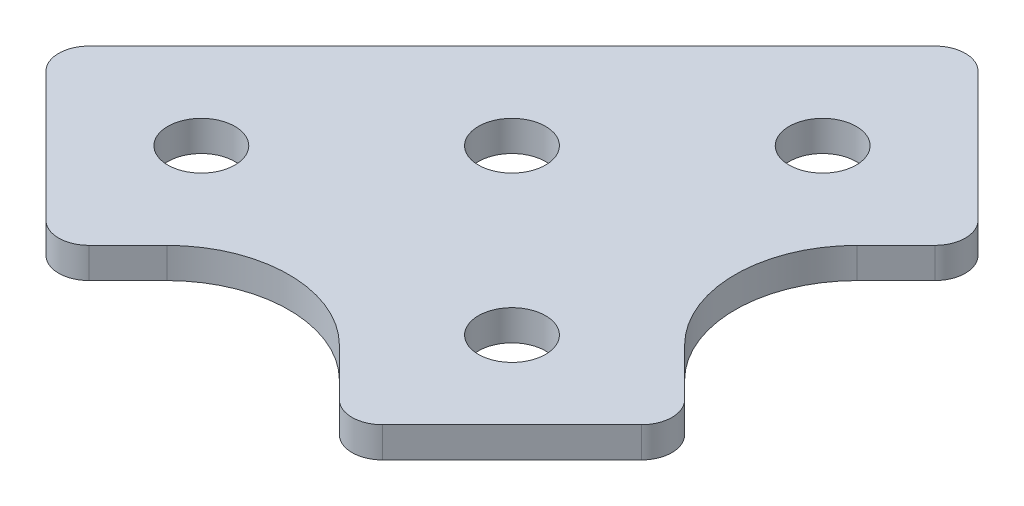
ISO-10303-21;
HEADER;
FILE_DESCRIPTION(('STEP AP214'),'2;1');
FILE_NAME('part.step','',(''),(''),'','','');
FILE_SCHEMA(('AUTOMOTIVE_DESIGN { 1 0 10303 214 1 1 1 1 }'));
ENDSEC;
DATA;
#1=APPLICATION_CONTEXT('core data for automotive mechanical design processes');
#2=APPLICATION_PROTOCOL_DEFINITION('international standard','automotive_design',2000,#1);
#3=PRODUCT_CONTEXT('',#1,'mechanical');
#4=PRODUCT('Part','Part','',(#3));
#5=PRODUCT_RELATED_PRODUCT_CATEGORY('part','',(#4));
#6=PRODUCT_DEFINITION_FORMATION('','',#4);
#7=PRODUCT_DEFINITION_CONTEXT('part definition',#1,'design');
#8=PRODUCT_DEFINITION('design','',#6,#7);
#9=PRODUCT_DEFINITION_SHAPE('','',#8);
#10=(LENGTH_UNIT() NAMED_UNIT(*) SI_UNIT(.MILLI.,.METRE.));
#11=(NAMED_UNIT(*) PLANE_ANGLE_UNIT() SI_UNIT($,.RADIAN.));
#12=(NAMED_UNIT(*) SI_UNIT($,.STERADIAN.) SOLID_ANGLE_UNIT());
#13=UNCERTAINTY_MEASURE_WITH_UNIT(LENGTH_MEASURE(1.E-05),#10,'distance_accuracy_value','');
#14=(GEOMETRIC_REPRESENTATION_CONTEXT(3) GLOBAL_UNCERTAINTY_ASSIGNED_CONTEXT((#13)) GLOBAL_UNIT_ASSIGNED_CONTEXT((#10,
#11,#12)) REPRESENTATION_CONTEXT('',''));
#15=CARTESIAN_POINT('',(0.,0.,0.));
#16=DIRECTION('',(0.,0.,1.));
#17=DIRECTION('',(1.,0.,0.));
#18=AXIS2_PLACEMENT_3D('',#15,#16,#17);
#19=CARTESIAN_POINT('',(0.,3.175,0.));
#20=DIRECTION('',(0.707106781186548,0.,0.707106781186547));
#21=DIRECTION('',(0.707106781186547,0.,-0.707106781186548));
#22=AXIS2_PLACEMENT_3D('',#19,#20,#21);
#23=PLANE('',#22);
#24=DIRECTION('',(-0.707106781186546,0.,0.707106781186548));
#25=VECTOR('',#24,1.);
#26=CARTESIAN_POINT('',(0.,3.175,0.));
#27=LINE('',#26,#25);
#28=CARTESIAN_POINT('',(-8.98025612106918,3.175,8.9802561210692));
#29=VERTEX_POINT('',#28);
#30=CARTESIAN_POINT('',(-13.0213713755503,3.175,13.0213713755503));
#31=VERTEX_POINT('',#30);
#32=EDGE_CURVE('E314',#29,#31,#27,.T.);
#33=ORIENTED_EDGE('',*,*,#32,.T.);
#34=DIRECTION('',(0.,1.,0.));
#35=VECTOR('',#34,1.);
#36=CARTESIAN_POINT('',(-13.0213713755503,3.175,13.0213713755504));
#37=LINE('',#36,#35);
#38=CARTESIAN_POINT('',(-13.0213713755503,0.,13.0213713755503));
#39=VERTEX_POINT('',#38);
#40=EDGE_CURVE('E11',#31,#39,#37,.F.);
#41=ORIENTED_EDGE('',*,*,#40,.T.);
#42=DIRECTION('',(-0.707106781186546,0.,0.707106781186548));
#43=VECTOR('',#42,1.);
#44=CARTESIAN_POINT('',(0.,0.,0.));
#45=LINE('',#44,#43);
#46=CARTESIAN_POINT('',(-8.98025612106918,0.,8.9802561210692));
#47=VERTEX_POINT('',#46);
#48=EDGE_CURVE('E327',#47,#39,#45,.T.);
#49=ORIENTED_EDGE('',*,*,#48,.F.);
#50=DIRECTION('',(0.,-1.,0.));
#51=VECTOR('',#50,1.);
#52=CARTESIAN_POINT('',(-8.98025612106918,3.175,8.98025612106921));
#53=LINE('',#52,#51);
#54=EDGE_CURVE('E204',#47,#29,#53,.F.);
#55=ORIENTED_EDGE('',*,*,#54,.T.);
#56=EDGE_LOOP('',(#33,#41,#49,#55));
#57=FACE_BOUND('',#56,.T.);
#58=ADVANCED_FACE('F45',(#57),#23,.T.);
#59=CARTESIAN_POINT('',(32.3289220358488,3.175,32.3289220358491));
#60=DIRECTION('',(-0.70710678118655,0.,0.707106781186545));
#61=DIRECTION('',(0.707106781186545,0.,0.70710678118655));
#62=AXIS2_PLACEMENT_3D('',#59,#60,#61);
#63=PLANE('',#62);
#64=DIRECTION('',(-0.707106781186545,0.,-0.70710678118655));
#65=VECTOR('',#64,1.);
#66=CARTESIAN_POINT('',(32.3289220358488,0.,32.3289220358491));
#67=LINE('',#66,#65);
#68=CARTESIAN_POINT('',(13.9193969876572,0.,13.9193969876573));
#69=VERTEX_POINT('',#68);
#70=CARTESIAN_POINT('',(8.98025612106917,0.,8.98025612106923));
#71=VERTEX_POINT('',#70);
#72=EDGE_CURVE('E330',#69,#71,#67,.T.);
#73=ORIENTED_EDGE('',*,*,#72,.F.);
#74=DIRECTION('',(0.,1.,0.));
#75=VECTOR('',#74,1.);
#76=CARTESIAN_POINT('',(13.9193969876572,3.175,13.9193969876573));
#77=LINE('',#76,#75);
#78=CARTESIAN_POINT('',(13.9193969876572,3.175,13.9193969876573));
#79=VERTEX_POINT('',#78);
#80=EDGE_CURVE('E260',#69,#79,#77,.T.);
#81=ORIENTED_EDGE('',*,*,#80,.T.);
#82=DIRECTION('',(-0.707106781186545,0.,-0.70710678118655));
#83=VECTOR('',#82,1.);
#84=CARTESIAN_POINT('',(32.3289220358488,3.175,32.3289220358491));
#85=LINE('',#84,#83);
#86=CARTESIAN_POINT('',(8.98025612106917,3.175,8.98025612106923));
#87=VERTEX_POINT('',#86);
#88=EDGE_CURVE('E195',#79,#87,#85,.T.);
#89=ORIENTED_EDGE('',*,*,#88,.T.);
#90=DIRECTION('',(0.,-1.,0.));
#91=VECTOR('',#90,1.);
#92=CARTESIAN_POINT('',(8.98025612106916,0.,8.98025612106922));
#93=LINE('',#92,#91);
#94=EDGE_CURVE('E193',#87,#71,#93,.T.);
#95=ORIENTED_EDGE('',*,*,#94,.T.);
#96=EDGE_LOOP('',(#73,#81,#89,#95));
#97=FACE_BOUND('',#96,.T.);
#98=ADVANCED_FACE('F412',(#97),#63,.T.);
#99=CARTESIAN_POINT('',(0.,3.175,-35.9210244842767));
#100=DIRECTION('',(0.707106781186549,0.,-0.707106781186546));
#101=DIRECTION('',(-0.707106781186546,0.,-0.707106781186549));
#102=AXIS2_PLACEMENT_3D('',#99,#100,#101);
#103=PLANE('',#102);
#104=DIRECTION('',(-0.707106781186545,0.,-0.70710678118655));
#105=VECTOR('',#104,1.);
#106=CARTESIAN_POINT('',(50.2894342779872,3.175,14.3684097937108));
#107=LINE('',#106,#105);
#108=CARTESIAN_POINT('',(31.8799092297956,3.175,-4.04111525448094));
#109=VERTEX_POINT('',#108);
#110=CARTESIAN_POINT('',(26.9407683632075,3.175,-8.98025612106905));
#111=VERTEX_POINT('',#110);
#112=EDGE_CURVE('E167',#109,#111,#107,.T.);
#113=ORIENTED_EDGE('',*,*,#112,.F.);
#114=DIRECTION('',(0.,1.,0.));
#115=VECTOR('',#114,1.);
#116=CARTESIAN_POINT('',(31.8799092297956,3.175,-4.04111525448096));
#117=LINE('',#116,#115);
#118=CARTESIAN_POINT('',(31.8799092297956,0.,-4.04111525448097));
#119=VERTEX_POINT('',#118);
#120=EDGE_CURVE('E240',#109,#119,#117,.F.);
#121=ORIENTED_EDGE('',*,*,#120,.T.);
#122=DIRECTION('',(0.707106781186546,0.,0.707106781186549));
#123=VECTOR('',#122,1.);
#124=CARTESIAN_POINT('',(0.,0.,-35.9210244842767));
#125=LINE('',#124,#123);
#126=CARTESIAN_POINT('',(26.9407683632075,0.,-8.98025612106907));
#127=VERTEX_POINT('',#126);
#128=EDGE_CURVE('E320',#127,#119,#125,.T.);
#129=ORIENTED_EDGE('',*,*,#128,.F.);
#130=DIRECTION('',(0.,-1.,0.));
#131=VECTOR('',#130,1.);
#132=CARTESIAN_POINT('',(26.9407683632075,3.175,-8.98025612106907));
#133=LINE('',#132,#131);
#134=EDGE_CURVE('E189',#127,#111,#133,.F.);
#135=ORIENTED_EDGE('',*,*,#134,.T.);
#136=EDGE_LOOP('',(#113,#121,#129,#135));
#137=FACE_BOUND('',#136,.T.);
#138=ADVANCED_FACE('F418',(#137),#103,.T.);
#139=CARTESIAN_POINT('',(-17.9605122421382,3.175,-17.9605122421383));
#140=DIRECTION('',(-0.70710678118655,0.,-0.707106781186545));
#141=DIRECTION('',(-0.707106781186545,0.,0.70710678118655));
#142=AXIS2_PLACEMENT_3D('',#139,#140,#141);
#143=PLANE('',#142);
#144=DIRECTION('',(-0.707106781186547,0.,0.707106781186548));
#145=VECTOR('',#144,1.);
#146=CARTESIAN_POINT('',(-17.9605122421382,3.175,-17.9605122421383));
#147=LINE('',#146,#145);
#148=CARTESIAN_POINT('',(13.0213713755503,3.175,-48.9423958598269));
#149=VERTEX_POINT('',#148);
#150=CARTESIAN_POINT('',(-30.9818836176886,3.175,-4.93914086658794));
#151=VERTEX_POINT('',#150);
#152=EDGE_CURVE('E310',#149,#151,#147,.T.);
#153=ORIENTED_EDGE('',*,*,#152,.F.);
#154=DIRECTION('',(0.,1.,0.));
#155=VECTOR('',#154,1.);
#156=CARTESIAN_POINT('',(13.0213713755502,0.,-48.942395859827));
#157=LINE('',#156,#155);
#158=CARTESIAN_POINT('',(13.0213713755502,0.,-48.942395859827));
#159=VERTEX_POINT('',#158);
#160=EDGE_CURVE('E274',#149,#159,#157,.F.);
#161=ORIENTED_EDGE('',*,*,#160,.T.);
#162=DIRECTION('',(0.707106781186545,0.,-0.70710678118655));
#163=VECTOR('',#162,1.);
#164=CARTESIAN_POINT('',(-17.9605122421382,0.,-17.9605122421383));
#165=LINE('',#164,#163);
#166=CARTESIAN_POINT('',(-30.9818836176886,0.,-4.9391408665879));
#167=VERTEX_POINT('',#166);
#168=EDGE_CURVE('E198',#167,#159,#165,.T.);
#169=ORIENTED_EDGE('',*,*,#168,.F.);
#170=DIRECTION('',(0.,1.,0.));
#171=VECTOR('',#170,1.);
#172=CARTESIAN_POINT('',(-30.9818836176886,3.175,-4.9391408665879));
#173=LINE('',#172,#171);
#174=EDGE_CURVE('E270',#167,#151,#173,.T.);
#175=ORIENTED_EDGE('',*,*,#174,.T.);
#176=EDGE_LOOP('',(#153,#161,#169,#175));
#177=FACE_BOUND('',#176,.T.);
#178=ADVANCED_FACE('F309',(#177),#143,.T.);
#179=CARTESIAN_POINT('',(0.,3.175,0.));
#180=DIRECTION('',(0.,-1.,0.));
#181=DIRECTION('',(0.,0.,-1.));
#182=AXIS2_PLACEMENT_3D('',#179,#180,#181);
#183=PLANE('',#182);
#184=CARTESIAN_POINT('',(-16.1644610179244,3.175,-1.79605122421382));
#185=DIRECTION('',(0.,1.,0.));
#186=DIRECTION('',(0.,0.,1.));
#187=AXIS2_PLACEMENT_3D('',#184,#185,#186);
#188=CIRCLE('',#187,3.49250000000001);
#189=CARTESIAN_POINT('',(-16.1644610179244,3.175,1.69644877578618));
#190=VERTEX_POINT('',#189);
#191=EDGE_CURVE('E376',#190,#190,#188,.T.);
#192=ORIENTED_EDGE('',*,*,#191,.F.);
#193=EDGE_LOOP('',(#192));
#194=FACE_BOUND('',#193,.T.);
#195=CARTESIAN_POINT('',(0.,3.175,-17.9605122421383));
#196=DIRECTION('',(0.,1.,0.));
#197=DIRECTION('',(0.,0.,1.));
#198=AXIS2_PLACEMENT_3D('',#195,#196,#197);
#199=CIRCLE('',#198,3.49250000000001);
#200=CARTESIAN_POINT('',(0.,3.175,-14.4680122421383));
#201=VERTEX_POINT('',#200);
#202=EDGE_CURVE('E322',#201,#201,#199,.T.);
#203=ORIENTED_EDGE('',*,*,#202,.F.);
#204=EDGE_LOOP('',(#203));
#205=FACE_BOUND('',#204,.T.);
#206=CARTESIAN_POINT('',(17.0624866300314,3.175,-0.898025612106839));
#207=DIRECTION('',(0.,1.,0.));
#208=DIRECTION('',(0.,0.,1.));
#209=AXIS2_PLACEMENT_3D('',#206,#207,#208);
#210=CIRCLE('',#209,3.4925);
#211=CARTESIAN_POINT('',(17.0624866300314,3.175,2.59447438789316));
#212=VERTEX_POINT('',#211);
#213=EDGE_CURVE('E184',#212,#212,#210,.T.);
#214=ORIENTED_EDGE('',*,*,#213,.F.);
#215=EDGE_LOOP('',(#214));
#216=FACE_BOUND('',#215,.T.);
#217=CARTESIAN_POINT('',(16.1644610179245,3.175,-34.1249732600627));
#218=DIRECTION('',(0.,-1.,0.));
#219=DIRECTION('',(1.,0.,0.));
#220=AXIS2_PLACEMENT_3D('',#217,#218,#219);
#221=CIRCLE('',#220,3.49250000000001);
#222=CARTESIAN_POINT('',(19.6569610179246,3.175,-34.1249732600627));
#223=VERTEX_POINT('',#222);
#224=EDGE_CURVE('E302',#223,#223,#221,.T.);
#225=ORIENTED_EDGE('',*,*,#224,.T.);
#226=EDGE_LOOP('',(#225));
#227=FACE_BOUND('',#226,.T.);
#228=DIRECTION('',(0.70710678118655,0.,-0.707106781186545));
#229=VECTOR('',#228,1.);
#230=CARTESIAN_POINT('',(16.1644610179245,3.175,16.1644610179246));
#231=LINE('',#230,#229);
#232=CARTESIAN_POINT('',(18.4095250481918,3.175,13.9193969876573));
#233=VERTEX_POINT('',#232);
#234=CARTESIAN_POINT('',(31.8799092297956,3.175,0.449012806053611));
#235=VERTEX_POINT('',#234);
#236=EDGE_CURVE('E346',#233,#235,#231,.T.);
#237=ORIENTED_EDGE('',*,*,#236,.T.);
#238=CARTESIAN_POINT('',(29.6348451995283,3.175,-1.79605122421368));
#239=DIRECTION('',(0.,-1.,0.));
#240=DIRECTION('',(0.,0.,-1.));
#241=AXIS2_PLACEMENT_3D('',#238,#239,#240);
#242=CIRCLE('',#241,3.175);
#243=EDGE_CURVE('E237',#235,#109,#242,.F.);
#244=ORIENTED_EDGE('',*,*,#243,.T.);
#245=ORIENTED_EDGE('',*,*,#112,.T.);
#246=CARTESIAN_POINT('',(35.9210244842767,3.175,-17.9605122421382));
#247=DIRECTION('',(0.,-1.,0.));
#248=DIRECTION('',(0.,0.,-1.));
#249=AXIS2_PLACEMENT_3D('',#246,#247,#248);
#250=CIRCLE('',#249,12.7);
#251=CARTESIAN_POINT('',(26.9407683632076,3.175,-26.9407683632074));
#252=VERTEX_POINT('',#251);
#253=EDGE_CURVE('E161',#111,#252,#250,.T.);
#254=ORIENTED_EDGE('',*,*,#253,.T.);
#255=DIRECTION('',(0.707106781186551,0.,-0.707106781186544));
#256=VECTOR('',#255,1.);
#257=CARTESIAN_POINT('',(17.9605122421383,3.175,-17.9605122421382));
#258=LINE('',#257,#256);
#259=CARTESIAN_POINT('',(30.9818836176887,3.175,-30.9818836176885));
#260=VERTEX_POINT('',#259);
#261=EDGE_CURVE('E165',#252,#260,#258,.T.);
#262=ORIENTED_EDGE('',*,*,#261,.T.);
#263=CARTESIAN_POINT('',(28.7368195874214,3.175,-33.2269476479558));
#264=DIRECTION('',(0.,-1.,0.));
#265=DIRECTION('',(0.,0.,-1.));
#266=AXIS2_PLACEMENT_3D('',#263,#264,#265);
#267=CIRCLE('',#266,3.175);
#268=CARTESIAN_POINT('',(30.9818836176887,3.175,-35.4720116782231));
#269=VERTEX_POINT('',#268);
#270=EDGE_CURVE('E228',#260,#269,#267,.F.);
#271=ORIENTED_EDGE('',*,*,#270,.T.);
#272=DIRECTION('',(0.707106781186548,0.,0.707106781186548));
#273=VECTOR('',#272,1.);
#274=CARTESIAN_POINT('',(33.2269476479559,3.175,-33.2269476479559));
#275=LINE('',#274,#273);
#276=CARTESIAN_POINT('',(17.5114994360848,3.175,-48.942395859827));
#277=VERTEX_POINT('',#276);
#278=EDGE_CURVE('E353',#277,#269,#275,.T.);
#279=ORIENTED_EDGE('',*,*,#278,.F.);
#280=CARTESIAN_POINT('',(15.2664354058175,3.175,-46.6973318295597));
#281=DIRECTION('',(0.,-1.,0.));
#282=DIRECTION('',(0.,0.,-1.));
#283=AXIS2_PLACEMENT_3D('',#280,#281,#282);
#284=CIRCLE('',#283,3.175);
#285=EDGE_CURVE('E231',#277,#149,#284,.F.);
#286=ORIENTED_EDGE('',*,*,#285,.T.);
#287=ORIENTED_EDGE('',*,*,#152,.T.);
#288=CARTESIAN_POINT('',(-28.7368195874213,3.175,-2.69407683632062));
#289=DIRECTION('',(0.,-1.,0.));
#290=DIRECTION('',(0.,0.,-1.));
#291=AXIS2_PLACEMENT_3D('',#288,#289,#290);
#292=CIRCLE('',#291,3.175);
#293=CARTESIAN_POINT('',(-30.9818836176886,3.175,-0.449012806053337));
#294=VERTEX_POINT('',#293);
#295=EDGE_CURVE('E225',#151,#294,#292,.F.);
#296=ORIENTED_EDGE('',*,*,#295,.T.);
#297=DIRECTION('',(0.707106781186547,0.,0.707106781186548));
#298=VECTOR('',#297,1.);
#299=CARTESIAN_POINT('',(-15.2664354058176,3.175,15.2664354058176));
#300=LINE('',#299,#298);
#301=CARTESIAN_POINT('',(-17.5114994360849,3.175,13.0213713755504));
#302=VERTEX_POINT('',#301);
#303=EDGE_CURVE('E292',#294,#302,#300,.T.);
#304=ORIENTED_EDGE('',*,*,#303,.T.);
#305=CARTESIAN_POINT('',(-15.2664354058176,3.175,10.7763073452831));
#306=DIRECTION('',(0.,-1.,0.));
#307=DIRECTION('',(0.,0.,-1.));
#308=AXIS2_PLACEMENT_3D('',#305,#306,#307);
#309=CIRCLE('',#308,3.175);
#310=EDGE_CURVE('E222',#302,#31,#309,.F.);
#311=ORIENTED_EDGE('',*,*,#310,.T.);
#312=ORIENTED_EDGE('',*,*,#32,.F.);
#313=CARTESIAN_POINT('',(0.,3.175,17.9605122421383));
#314=DIRECTION('',(0.,-1.,0.));
#315=DIRECTION('',(0.,0.,-1.));
#316=AXIS2_PLACEMENT_3D('',#313,#314,#315);
#317=CIRCLE('',#316,12.7);
#318=EDGE_CURVE('E211',#29,#87,#317,.T.);
#319=ORIENTED_EDGE('',*,*,#318,.T.);
#320=ORIENTED_EDGE('',*,*,#88,.F.);
#321=CARTESIAN_POINT('',(16.1644610179245,3.175,11.67433295739));
#322=DIRECTION('',(0.,-1.,0.));
#323=DIRECTION('',(0.,0.,-1.));
#324=AXIS2_PLACEMENT_3D('',#321,#322,#323);
#325=CIRCLE('',#324,3.175);
#326=EDGE_CURVE('E234',#79,#233,#325,.F.);
#327=ORIENTED_EDGE('',*,*,#326,.T.);
#328=EDGE_LOOP('',(#237,#244,#245,#254,#262,#271,#279,#286,#287,#296,#304,#311,#312,#319,#320,#327));
#329=FACE_BOUND('',#328,.T.);
#330=ADVANCED_FACE('F164',(#194,#205,#216,#227,#329),#183,.F.);
#331=CARTESIAN_POINT('',(0.,0.,0.));
#332=DIRECTION('',(0.,-1.,0.));
#333=DIRECTION('',(0.,0.,-1.));
#334=AXIS2_PLACEMENT_3D('',#331,#332,#333);
#335=PLANE('',#334);
#336=CARTESIAN_POINT('',(-16.1644610179244,0.,-1.79605122421382));
#337=DIRECTION('',(0.,1.,0.));
#338=DIRECTION('',(0.,0.,1.));
#339=AXIS2_PLACEMENT_3D('',#336,#337,#338);
#340=CIRCLE('',#339,3.49250000000001);
#341=CARTESIAN_POINT('',(-16.1644610179244,0.,1.69644877578618));
#342=VERTEX_POINT('',#341);
#343=EDGE_CURVE('E331',#342,#342,#340,.T.);
#344=ORIENTED_EDGE('',*,*,#343,.T.);
#345=EDGE_LOOP('',(#344));
#346=FACE_BOUND('',#345,.T.);
#347=CARTESIAN_POINT('',(0.,0.,-17.9605122421383));
#348=DIRECTION('',(0.,1.,0.));
#349=DIRECTION('',(0.,0.,1.));
#350=AXIS2_PLACEMENT_3D('',#347,#348,#349);
#351=CIRCLE('',#350,3.49250000000001);
#352=CARTESIAN_POINT('',(0.,0.,-14.4680122421383));
#353=VERTEX_POINT('',#352);
#354=EDGE_CURVE('E379',#353,#353,#351,.T.);
#355=ORIENTED_EDGE('',*,*,#354,.T.);
#356=EDGE_LOOP('',(#355));
#357=FACE_BOUND('',#356,.T.);
#358=CARTESIAN_POINT('',(17.0624866300314,0.,-0.898025612106839));
#359=DIRECTION('',(0.,1.,0.));
#360=DIRECTION('',(0.,0.,1.));
#361=AXIS2_PLACEMENT_3D('',#358,#359,#360);
#362=CIRCLE('',#361,3.4925);
#363=CARTESIAN_POINT('',(17.0624866300314,0.,2.59447438789316));
#364=VERTEX_POINT('',#363);
#365=EDGE_CURVE('E366',#364,#364,#362,.T.);
#366=ORIENTED_EDGE('',*,*,#365,.T.);
#367=EDGE_LOOP('',(#366));
#368=FACE_BOUND('',#367,.T.);
#369=CARTESIAN_POINT('',(16.1644610179245,0.,-34.1249732600627));
#370=DIRECTION('',(0.,-1.,0.));
#371=DIRECTION('',(1.,0.,0.));
#372=AXIS2_PLACEMENT_3D('',#369,#370,#371);
#373=CIRCLE('',#372,3.49250000000001);
#374=CARTESIAN_POINT('',(19.6569610179246,0.,-34.1249732600627));
#375=VERTEX_POINT('',#374);
#376=EDGE_CURVE('E357',#375,#375,#373,.T.);
#377=ORIENTED_EDGE('',*,*,#376,.F.);
#378=EDGE_LOOP('',(#377));
#379=FACE_BOUND('',#378,.T.);
#380=ORIENTED_EDGE('',*,*,#128,.T.);
#381=CARTESIAN_POINT('',(29.6348451995283,0.,-1.79605122421368));
#382=DIRECTION('',(0.,-1.,0.));
#383=DIRECTION('',(0.,0.,-1.));
#384=AXIS2_PLACEMENT_3D('',#381,#382,#383);
#385=CIRCLE('',#384,3.175);
#386=CARTESIAN_POINT('',(31.8799092297956,0.,0.449012806053611));
#387=VERTEX_POINT('',#386);
#388=EDGE_CURVE('E257',#119,#387,#385,.T.);
#389=ORIENTED_EDGE('',*,*,#388,.T.);
#390=DIRECTION('',(0.70710678118655,0.,-0.707106781186545));
#391=VECTOR('',#390,1.);
#392=CARTESIAN_POINT('',(16.1644610179245,0.,16.1644610179246));
#393=LINE('',#392,#391);
#394=CARTESIAN_POINT('',(18.4095250481918,0.,13.9193969876573));
#395=VERTEX_POINT('',#394);
#396=EDGE_CURVE('E348',#395,#387,#393,.T.);
#397=ORIENTED_EDGE('',*,*,#396,.F.);
#398=CARTESIAN_POINT('',(16.1644610179245,0.,11.67433295739));
#399=DIRECTION('',(0.,-1.,0.));
#400=DIRECTION('',(0.,0.,-1.));
#401=AXIS2_PLACEMENT_3D('',#398,#399,#400);
#402=CIRCLE('',#401,3.175);
#403=EDGE_CURVE('E254',#395,#69,#402,.T.);
#404=ORIENTED_EDGE('',*,*,#403,.T.);
#405=ORIENTED_EDGE('',*,*,#72,.T.);
#406=CARTESIAN_POINT('',(0.,0.,17.9605122421383));
#407=DIRECTION('',(0.,-1.,0.));
#408=DIRECTION('',(0.,0.,-1.));
#409=AXIS2_PLACEMENT_3D('',#406,#407,#408);
#410=CIRCLE('',#409,12.7);
#411=EDGE_CURVE('E173',#71,#47,#410,.F.);
#412=ORIENTED_EDGE('',*,*,#411,.T.);
#413=ORIENTED_EDGE('',*,*,#48,.T.);
#414=CARTESIAN_POINT('',(-15.2664354058176,0.,10.7763073452831));
#415=DIRECTION('',(0.,-1.,0.));
#416=DIRECTION('',(0.,0.,-1.));
#417=AXIS2_PLACEMENT_3D('',#414,#415,#416);
#418=CIRCLE('',#417,3.175);
#419=CARTESIAN_POINT('',(-17.5114994360849,0.,13.0213713755504));
#420=VERTEX_POINT('',#419);
#421=EDGE_CURVE('E243',#39,#420,#418,.T.);
#422=ORIENTED_EDGE('',*,*,#421,.T.);
#423=DIRECTION('',(0.707106781186547,0.,0.707106781186548));
#424=VECTOR('',#423,1.);
#425=CARTESIAN_POINT('',(-15.2664354058176,0.,15.2664354058176));
#426=LINE('',#425,#424);
#427=CARTESIAN_POINT('',(-30.9818836176886,0.,-0.449012806053337));
#428=VERTEX_POINT('',#427);
#429=EDGE_CURVE('E289',#428,#420,#426,.T.);
#430=ORIENTED_EDGE('',*,*,#429,.F.);
#431=CARTESIAN_POINT('',(-28.7368195874213,0.,-2.69407683632062));
#432=DIRECTION('',(0.,-1.,0.));
#433=DIRECTION('',(0.,0.,-1.));
#434=AXIS2_PLACEMENT_3D('',#431,#432,#433);
#435=CIRCLE('',#434,3.175);
#436=EDGE_CURVE('E246',#428,#167,#435,.T.);
#437=ORIENTED_EDGE('',*,*,#436,.T.);
#438=ORIENTED_EDGE('',*,*,#168,.T.);
#439=CARTESIAN_POINT('',(15.2664354058175,0.,-46.6973318295597));
#440=DIRECTION('',(0.,-1.,0.));
#441=DIRECTION('',(0.,0.,-1.));
#442=AXIS2_PLACEMENT_3D('',#439,#440,#441);
#443=CIRCLE('',#442,3.175);
#444=CARTESIAN_POINT('',(17.5114994360848,0.,-48.942395859827));
#445=VERTEX_POINT('',#444);
#446=EDGE_CURVE('E251',#159,#445,#443,.T.);
#447=ORIENTED_EDGE('',*,*,#446,.T.);
#448=DIRECTION('',(0.707106781186548,0.,0.707106781186548));
#449=VECTOR('',#448,1.);
#450=CARTESIAN_POINT('',(33.2269476479559,0.,-33.2269476479559));
#451=LINE('',#450,#449);
#452=CARTESIAN_POINT('',(30.9818836176887,0.,-35.4720116782231));
#453=VERTEX_POINT('',#452);
#454=EDGE_CURVE('E452',#445,#453,#451,.T.);
#455=ORIENTED_EDGE('',*,*,#454,.T.);
#456=CARTESIAN_POINT('',(28.7368195874214,0.,-33.2269476479558));
#457=DIRECTION('',(0.,-1.,0.));
#458=DIRECTION('',(0.,0.,-1.));
#459=AXIS2_PLACEMENT_3D('',#456,#457,#458);
#460=CIRCLE('',#459,3.175);
#461=CARTESIAN_POINT('',(30.9818836176887,0.,-30.9818836176885));
#462=VERTEX_POINT('',#461);
#463=EDGE_CURVE('E61',#453,#462,#460,.T.);
#464=ORIENTED_EDGE('',*,*,#463,.T.);
#465=DIRECTION('',(0.707106781186551,0.,-0.707106781186544));
#466=VECTOR('',#465,1.);
#467=CARTESIAN_POINT('',(17.9605122421383,0.,-17.9605122421382));
#468=LINE('',#467,#466);
#469=CARTESIAN_POINT('',(26.9407683632076,0.,-26.9407683632074));
#470=VERTEX_POINT('',#469);
#471=EDGE_CURVE('E185',#470,#462,#468,.T.);
#472=ORIENTED_EDGE('',*,*,#471,.F.);
#473=CARTESIAN_POINT('',(35.9210244842767,0.,-17.9605122421382));
#474=DIRECTION('',(0.,-1.,0.));
#475=DIRECTION('',(0.,0.,-1.));
#476=AXIS2_PLACEMENT_3D('',#473,#474,#475);
#477=CIRCLE('',#476,12.7);
#478=EDGE_CURVE('E174',#470,#127,#477,.F.);
#479=ORIENTED_EDGE('',*,*,#478,.T.);
#480=EDGE_LOOP('',(#380,#389,#397,#404,#405,#412,#413,#422,#430,#437,#438,#447,#455,#464,#472,#479));
#481=FACE_BOUND('',#480,.T.);
#482=ADVANCED_FACE('F296',(#346,#357,#368,#379,#481),#335,.T.);
#483=CARTESIAN_POINT('',(0.,0.,-17.9605122421383));
#484=DIRECTION('',(0.,1.,0.));
#485=DIRECTION('',(0.,0.,1.));
#486=AXIS2_PLACEMENT_3D('',#483,#484,#485);
#487=CYLINDRICAL_SURFACE('',#486,3.49250000000001);
#488=ORIENTED_EDGE('',*,*,#354,.F.);
#489=EDGE_LOOP('',(#488));
#490=FACE_BOUND('',#489,.T.);
#491=ORIENTED_EDGE('',*,*,#202,.T.);
#492=EDGE_LOOP('',(#491));
#493=FACE_BOUND('',#492,.T.);
#494=ADVANCED_FACE('F388',(#490,#493),#487,.F.);
#495=CARTESIAN_POINT('',(-16.1644610179244,0.,-1.79605122421382));
#496=DIRECTION('',(0.,1.,0.));
#497=DIRECTION('',(0.,0.,1.));
#498=AXIS2_PLACEMENT_3D('',#495,#496,#497);
#499=CYLINDRICAL_SURFACE('',#498,3.49250000000001);
#500=ORIENTED_EDGE('',*,*,#343,.F.);
#501=EDGE_LOOP('',(#500));
#502=FACE_BOUND('',#501,.T.);
#503=ORIENTED_EDGE('',*,*,#191,.T.);
#504=EDGE_LOOP('',(#503));
#505=FACE_BOUND('',#504,.T.);
#506=ADVANCED_FACE('F607',(#502,#505),#499,.F.);
#507=CARTESIAN_POINT('',(17.0624866300314,0.,-0.898025612106839));
#508=DIRECTION('',(0.,1.,0.));
#509=DIRECTION('',(0.,0.,1.));
#510=AXIS2_PLACEMENT_3D('',#507,#508,#509);
#511=CYLINDRICAL_SURFACE('',#510,3.4925);
#512=ORIENTED_EDGE('',*,*,#365,.F.);
#513=EDGE_LOOP('',(#512));
#514=FACE_BOUND('',#513,.T.);
#515=ORIENTED_EDGE('',*,*,#213,.T.);
#516=EDGE_LOOP('',(#515));
#517=FACE_BOUND('',#516,.T.);
#518=ADVANCED_FACE('F408',(#514,#517),#511,.F.);
#519=CARTESIAN_POINT('',(17.9605122421383,3.175,-17.9605122421382));
#520=DIRECTION('',(0.707106781186544,0.,0.707106781186551));
#521=DIRECTION('',(-0.707106781186551,0.,0.707106781186544));
#522=AXIS2_PLACEMENT_3D('',#519,#520,#521);
#523=PLANE('',#522);
#524=ORIENTED_EDGE('',*,*,#471,.T.);
#525=DIRECTION('',(0.,1.,0.));
#526=VECTOR('',#525,1.);
#527=CARTESIAN_POINT('',(30.9818836176887,3.175,-30.9818836176885));
#528=LINE('',#527,#526);
#529=EDGE_CURVE('E182',#462,#260,#528,.T.);
#530=ORIENTED_EDGE('',*,*,#529,.T.);
#531=ORIENTED_EDGE('',*,*,#261,.F.);
#532=DIRECTION('',(0.,-1.,0.));
#533=VECTOR('',#532,1.);
#534=CARTESIAN_POINT('',(26.9407683632076,0.,-26.9407683632074));
#535=LINE('',#534,#533);
#536=EDGE_CURVE('E180',#252,#470,#535,.T.);
#537=ORIENTED_EDGE('',*,*,#536,.T.);
#538=EDGE_LOOP('',(#524,#530,#531,#537));
#539=FACE_BOUND('',#538,.T.);
#540=ADVANCED_FACE('F179',(#539),#523,.T.);
#541=CARTESIAN_POINT('',(16.1644610179245,0.,-34.1249732600627));
#542=DIRECTION('',(0.,1.,0.));
#543=DIRECTION('',(1.,0.,0.));
#544=AXIS2_PLACEMENT_3D('',#541,#542,#543);
#545=CYLINDRICAL_SURFACE('',#544,3.49250000000001);
#546=ORIENTED_EDGE('',*,*,#376,.T.);
#547=EDGE_LOOP('',(#546));
#548=FACE_BOUND('',#547,.T.);
#549=ORIENTED_EDGE('',*,*,#224,.F.);
#550=EDGE_LOOP('',(#549));
#551=FACE_BOUND('',#550,.T.);
#552=ADVANCED_FACE('F398',(#548,#551),#545,.F.);
#553=CARTESIAN_POINT('',(33.2269476479559,0.,-33.2269476479559));
#554=DIRECTION('',(-0.707106781186548,0.,0.707106781186548));
#555=DIRECTION('',(0.707106781186548,0.,0.707106781186548));
#556=AXIS2_PLACEMENT_3D('',#553,#554,#555);
#557=PLANE('',#556);
#558=ORIENTED_EDGE('',*,*,#454,.F.);
#559=DIRECTION('',(0.,1.,0.));
#560=VECTOR('',#559,1.);
#561=CARTESIAN_POINT('',(17.5114994360848,3.175,-48.942395859827));
#562=LINE('',#561,#560);
#563=EDGE_CURVE('E266',#445,#277,#562,.T.);
#564=ORIENTED_EDGE('',*,*,#563,.T.);
#565=ORIENTED_EDGE('',*,*,#278,.T.);
#566=DIRECTION('',(0.,1.,0.));
#567=VECTOR('',#566,1.);
#568=CARTESIAN_POINT('',(30.9818836176887,0.,-35.4720116782231));
#569=LINE('',#568,#567);
#570=EDGE_CURVE('E69',#269,#453,#569,.F.);
#571=ORIENTED_EDGE('',*,*,#570,.T.);
#572=EDGE_LOOP('',(#558,#564,#565,#571));
#573=FACE_BOUND('',#572,.T.);
#574=ADVANCED_FACE('F400',(#573),#557,.F.);
#575=CARTESIAN_POINT('',(16.1644610179245,0.,16.1644610179246));
#576=DIRECTION('',(0.707106781186545,0.,0.70710678118655));
#577=DIRECTION('',(0.70710678118655,0.,-0.707106781186545));
#578=AXIS2_PLACEMENT_3D('',#575,#576,#577);
#579=PLANE('',#578);
#580=ORIENTED_EDGE('',*,*,#396,.T.);
#581=DIRECTION('',(0.,1.,0.));
#582=VECTOR('',#581,1.);
#583=CARTESIAN_POINT('',(31.8799092297956,0.,0.449012806053611));
#584=LINE('',#583,#582);
#585=EDGE_CURVE('E218',#387,#235,#584,.T.);
#586=ORIENTED_EDGE('',*,*,#585,.T.);
#587=ORIENTED_EDGE('',*,*,#236,.F.);
#588=DIRECTION('',(0.,1.,0.));
#589=VECTOR('',#588,1.);
#590=CARTESIAN_POINT('',(18.4095250481918,0.,13.9193969876573));
#591=LINE('',#590,#589);
#592=EDGE_CURVE('E215',#233,#395,#591,.F.);
#593=ORIENTED_EDGE('',*,*,#592,.T.);
#594=EDGE_LOOP('',(#580,#586,#587,#593));
#595=FACE_BOUND('',#594,.T.);
#596=ADVANCED_FACE('F345',(#595),#579,.T.);
#597=CARTESIAN_POINT('',(-15.2664354058176,0.,15.2664354058176));
#598=DIRECTION('',(-0.707106781186548,0.,0.707106781186547));
#599=DIRECTION('',(0.707106781186547,0.,0.707106781186548));
#600=AXIS2_PLACEMENT_3D('',#597,#598,#599);
#601=PLANE('',#600);
#602=ORIENTED_EDGE('',*,*,#303,.F.);
#603=DIRECTION('',(0.,1.,0.));
#604=VECTOR('',#603,1.);
#605=CARTESIAN_POINT('',(-30.9818836176886,0.,-0.44901280605333));
#606=LINE('',#605,#604);
#607=EDGE_CURVE('E54',#294,#428,#606,.F.);
#608=ORIENTED_EDGE('',*,*,#607,.T.);
#609=ORIENTED_EDGE('',*,*,#429,.T.);
#610=DIRECTION('',(0.,1.,0.));
#611=VECTOR('',#610,1.);
#612=CARTESIAN_POINT('',(-17.5114994360849,0.,13.0213713755504));
#613=LINE('',#612,#611);
#614=EDGE_CURVE('E279',#420,#302,#613,.T.);
#615=ORIENTED_EDGE('',*,*,#614,.T.);
#616=EDGE_LOOP('',(#602,#608,#609,#615));
#617=FACE_BOUND('',#616,.T.);
#618=ADVANCED_FACE('F288',(#617),#601,.T.);
#619=CARTESIAN_POINT('',(35.9210244842767,3.175,-17.9605122421382));
#620=DIRECTION('',(0.,1.,0.));
#621=DIRECTION('',(0.,0.,1.));
#622=AXIS2_PLACEMENT_3D('',#619,#620,#621);
#623=CYLINDRICAL_SURFACE('',#622,12.7);
#624=ORIENTED_EDGE('',*,*,#253,.F.);
#625=ORIENTED_EDGE('',*,*,#134,.F.);
#626=ORIENTED_EDGE('',*,*,#478,.F.);
#627=ORIENTED_EDGE('',*,*,#536,.F.);
#628=EDGE_LOOP('',(#624,#625,#626,#627));
#629=FACE_BOUND('',#628,.T.);
#630=ADVANCED_FACE('F187',(#629),#623,.F.);
#631=CARTESIAN_POINT('',(0.,3.175,17.9605122421383));
#632=DIRECTION('',(0.,1.,0.));
#633=DIRECTION('',(0.,0.,1.));
#634=AXIS2_PLACEMENT_3D('',#631,#632,#633);
#635=CYLINDRICAL_SURFACE('',#634,12.7);
#636=ORIENTED_EDGE('',*,*,#318,.F.);
#637=ORIENTED_EDGE('',*,*,#54,.F.);
#638=ORIENTED_EDGE('',*,*,#411,.F.);
#639=ORIENTED_EDGE('',*,*,#94,.F.);
#640=EDGE_LOOP('',(#636,#637,#638,#639));
#641=FACE_BOUND('',#640,.T.);
#642=ADVANCED_FACE('F425',(#641),#635,.F.);
#643=CARTESIAN_POINT('',(29.6348451995283,0.,-1.79605122421368));
#644=DIRECTION('',(0.,1.,0.));
#645=DIRECTION('',(0.,0.,1.));
#646=AXIS2_PLACEMENT_3D('',#643,#644,#645);
#647=CYLINDRICAL_SURFACE('',#646,3.175);
#648=ORIENTED_EDGE('',*,*,#388,.F.);
#649=ORIENTED_EDGE('',*,*,#120,.F.);
#650=ORIENTED_EDGE('',*,*,#243,.F.);
#651=ORIENTED_EDGE('',*,*,#585,.F.);
#652=EDGE_LOOP('',(#648,#649,#650,#651));
#653=FACE_BOUND('',#652,.T.);
#654=ADVANCED_FACE('F342',(#653),#647,.T.);
#655=CARTESIAN_POINT('',(16.1644610179245,3.175,11.67433295739));
#656=DIRECTION('',(0.,1.,0.));
#657=DIRECTION('',(0.,0.,1.));
#658=AXIS2_PLACEMENT_3D('',#655,#656,#657);
#659=CYLINDRICAL_SURFACE('',#658,3.175);
#660=ORIENTED_EDGE('',*,*,#403,.F.);
#661=ORIENTED_EDGE('',*,*,#592,.F.);
#662=ORIENTED_EDGE('',*,*,#326,.F.);
#663=ORIENTED_EDGE('',*,*,#80,.F.);
#664=EDGE_LOOP('',(#660,#661,#662,#663));
#665=FACE_BOUND('',#664,.T.);
#666=ADVANCED_FACE('F431',(#665),#659,.T.);
#667=CARTESIAN_POINT('',(15.2664354058175,0.,-46.6973318295597));
#668=DIRECTION('',(0.,-1.,0.));
#669=DIRECTION('',(0.,0.,-1.));
#670=AXIS2_PLACEMENT_3D('',#667,#668,#669);
#671=CYLINDRICAL_SURFACE('',#670,3.175);
#672=ORIENTED_EDGE('',*,*,#446,.F.);
#673=ORIENTED_EDGE('',*,*,#160,.F.);
#674=ORIENTED_EDGE('',*,*,#285,.F.);
#675=ORIENTED_EDGE('',*,*,#563,.F.);
#676=EDGE_LOOP('',(#672,#673,#674,#675));
#677=FACE_BOUND('',#676,.T.);
#678=ADVANCED_FACE('F434',(#677),#671,.T.);
#679=CARTESIAN_POINT('',(28.7368195874214,3.175,-33.2269476479558));
#680=DIRECTION('',(0.,-1.,0.));
#681=DIRECTION('',(0.,0.,-1.));
#682=AXIS2_PLACEMENT_3D('',#679,#680,#681);
#683=CYLINDRICAL_SURFACE('',#682,3.175);
#684=ORIENTED_EDGE('',*,*,#463,.F.);
#685=ORIENTED_EDGE('',*,*,#570,.F.);
#686=ORIENTED_EDGE('',*,*,#270,.F.);
#687=ORIENTED_EDGE('',*,*,#529,.F.);
#688=EDGE_LOOP('',(#684,#685,#686,#687));
#689=FACE_BOUND('',#688,.T.);
#690=ADVANCED_FACE('F438',(#689),#683,.T.);
#691=CARTESIAN_POINT('',(-28.7368195874213,3.175,-2.69407683632062));
#692=DIRECTION('',(0.,1.,0.));
#693=DIRECTION('',(0.,0.,1.));
#694=AXIS2_PLACEMENT_3D('',#691,#692,#693);
#695=CYLINDRICAL_SURFACE('',#694,3.175);
#696=ORIENTED_EDGE('',*,*,#436,.F.);
#697=ORIENTED_EDGE('',*,*,#607,.F.);
#698=ORIENTED_EDGE('',*,*,#295,.F.);
#699=ORIENTED_EDGE('',*,*,#174,.F.);
#700=EDGE_LOOP('',(#696,#697,#698,#699));
#701=FACE_BOUND('',#700,.T.);
#702=ADVANCED_FACE('F305',(#701),#695,.T.);
#703=CARTESIAN_POINT('',(-15.2664354058176,0.,10.7763073452831));
#704=DIRECTION('',(0.,1.,0.));
#705=DIRECTION('',(0.,0.,1.));
#706=AXIS2_PLACEMENT_3D('',#703,#704,#705);
#707=CYLINDRICAL_SURFACE('',#706,3.175);
#708=ORIENTED_EDGE('',*,*,#421,.F.);
#709=ORIENTED_EDGE('',*,*,#40,.F.);
#710=ORIENTED_EDGE('',*,*,#310,.F.);
#711=ORIENTED_EDGE('',*,*,#614,.F.);
#712=EDGE_LOOP('',(#708,#709,#710,#711));
#713=FACE_BOUND('',#712,.T.);
#714=ADVANCED_FACE('F47',(#713),#707,.T.);
#715=CLOSED_SHELL('',(#58,#98,#138,#178,#330,#482,#494,#506,#518,#540,#552,#574,#596,#618,#630,
#642,#654,#666,#678,#690,#702,#714));
#716=MANIFOLD_SOLID_BREP('B2',#715);
#717=ADVANCED_BREP_SHAPE_REPRESENTATION('',(#18,#716),#14);
#718=SHAPE_DEFINITION_REPRESENTATION(#9,#717);
ENDSEC;
END-ISO-10303-21;
